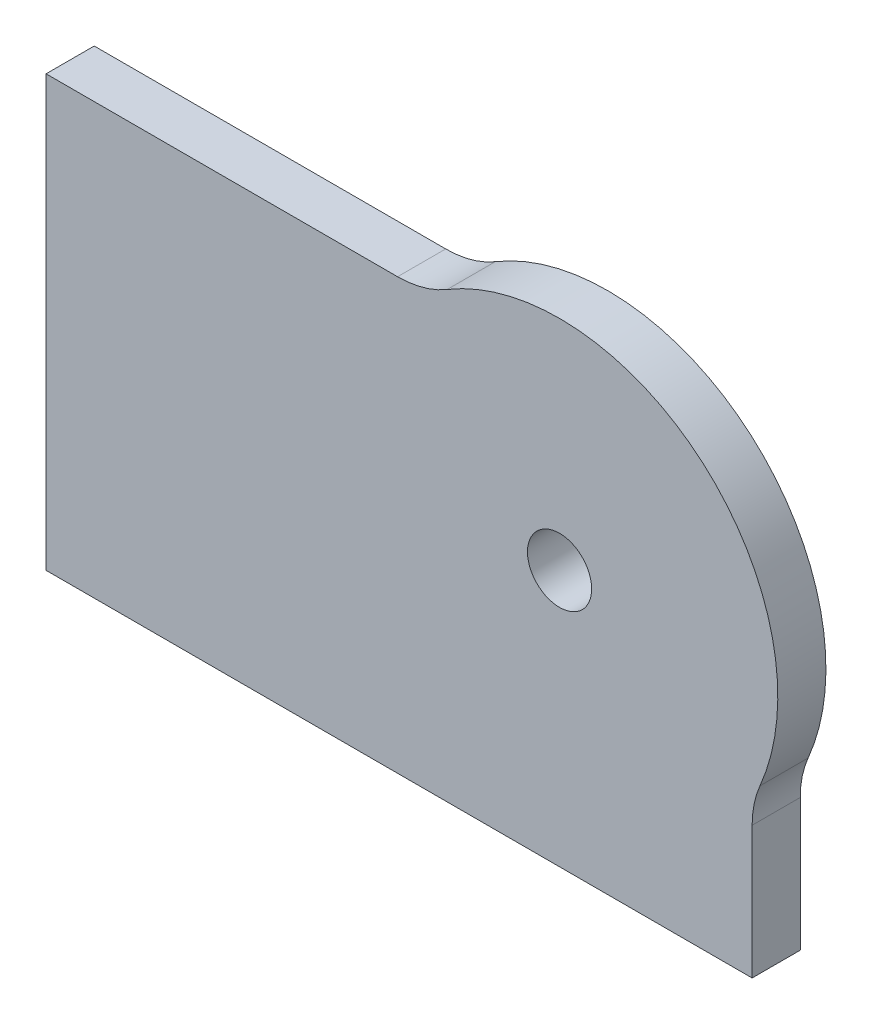
ISO-10303-21;
HEADER;
FILE_DESCRIPTION(('STEP AP214'),'2;1');
FILE_NAME('part.step','',(''),(''),'','','');
FILE_SCHEMA(('AUTOMOTIVE_DESIGN { 1 0 10303 214 1 1 1 1 }'));
ENDSEC;
DATA;
#1=APPLICATION_CONTEXT('core data for automotive mechanical design processes');
#2=APPLICATION_PROTOCOL_DEFINITION('international standard','automotive_design',2000,#1);
#3=PRODUCT_CONTEXT('',#1,'mechanical');
#4=PRODUCT('Part','Part','',(#3));
#5=PRODUCT_RELATED_PRODUCT_CATEGORY('part','',(#4));
#6=PRODUCT_DEFINITION_FORMATION('','',#4);
#7=PRODUCT_DEFINITION_CONTEXT('part definition',#1,'design');
#8=PRODUCT_DEFINITION('design','',#6,#7);
#9=PRODUCT_DEFINITION_SHAPE('','',#8);
#10=(LENGTH_UNIT() NAMED_UNIT(*) SI_UNIT(.MILLI.,.METRE.));
#11=(NAMED_UNIT(*) PLANE_ANGLE_UNIT() SI_UNIT($,.RADIAN.));
#12=(NAMED_UNIT(*) SI_UNIT($,.STERADIAN.) SOLID_ANGLE_UNIT());
#13=UNCERTAINTY_MEASURE_WITH_UNIT(LENGTH_MEASURE(1.E-05),#10,'distance_accuracy_value','');
#14=(GEOMETRIC_REPRESENTATION_CONTEXT(3) GLOBAL_UNCERTAINTY_ASSIGNED_CONTEXT((#13)) GLOBAL_UNIT_ASSIGNED_CONTEXT((#10,
#11,#12)) REPRESENTATION_CONTEXT('',''));
#15=CARTESIAN_POINT('',(0.,0.,0.));
#16=DIRECTION('',(0.,0.,1.));
#17=DIRECTION('',(1.,0.,0.));
#18=AXIS2_PLACEMENT_3D('',#15,#16,#17);
#19=CARTESIAN_POINT('',(69.5466491611252,104.14,9.525));
#20=DIRECTION('',(0.,0.,1.));
#21=DIRECTION('',(1.,0.,0.));
#22=AXIS2_PLACEMENT_3D('',#19,#20,#21);
#23=PLANE('',#22);
#24=DIRECTION('',(0.,-1.,0.));
#25=VECTOR('',#24,1.);
#26=CARTESIAN_POINT('',(0.,0.,9.525));
#27=LINE('',#26,#25);
#28=CARTESIAN_POINT('',(0.,85.09,9.525));
#29=VERTEX_POINT('',#28);
#30=CARTESIAN_POINT('',(0.,0.,9.525));
#31=VERTEX_POINT('',#30);
#32=EDGE_CURVE('E135',#29,#31,#27,.T.);
#33=ORIENTED_EDGE('',*,*,#32,.T.);
#34=DIRECTION('',(1.,0.,0.));
#35=VECTOR('',#34,1.);
#36=CARTESIAN_POINT('',(0.,0.,9.525));
#37=LINE('',#36,#35);
#38=CARTESIAN_POINT('',(139.7,0.,9.525));
#39=VERTEX_POINT('',#38);
#40=EDGE_CURVE('E88',#31,#39,#37,.T.);
#41=ORIENTED_EDGE('',*,*,#40,.T.);
#42=DIRECTION('',(0.,1.,0.));
#43=VECTOR('',#42,1.);
#44=CARTESIAN_POINT('',(139.7,0.,9.525));
#45=LINE('',#44,#43);
#46=CARTESIAN_POINT('',(139.7,26.1737863243251,9.525));
#47=VERTEX_POINT('',#46);
#48=EDGE_CURVE('E147',#39,#47,#45,.T.);
#49=ORIENTED_EDGE('',*,*,#48,.T.);
#50=CARTESIAN_POINT('',(158.75,26.1737863243251,9.525));
#51=DIRECTION('',(0.,0.,-1.));
#52=DIRECTION('',(-1.,0.,0.));
#53=AXIS2_PLACEMENT_3D('',#50,#51,#52);
#54=CIRCLE('',#53,19.05);
#55=CARTESIAN_POINT('',(141.255102040816,33.7124231638174,9.525));
#56=VERTEX_POINT('',#55);
#57=EDGE_CURVE('E104',#47,#56,#54,.T.);
#58=ORIENTED_EDGE('',*,*,#57,.T.);
#59=CARTESIAN_POINT('',(101.6,50.8,9.525));
#60=DIRECTION('',(0.,0.,1.));
#61=DIRECTION('',(1.,0.,0.));
#62=AXIS2_PLACEMENT_3D('',#59,#60,#61);
#63=CIRCLE('',#62,43.18);
#64=CARTESIAN_POINT('',(79.3588994179236,87.8114285714286,9.525));
#65=VERTEX_POINT('',#64);
#66=EDGE_CURVE('E98',#56,#65,#63,.T.);
#67=ORIENTED_EDGE('',*,*,#66,.T.);
#68=CARTESIAN_POINT('',(69.5466491611252,104.14,9.525));
#69=DIRECTION('',(0.,0.,-1.));
#70=DIRECTION('',(1.,0.,0.));
#71=AXIS2_PLACEMENT_3D('',#68,#69,#70);
#72=CIRCLE('',#71,19.05);
#73=CARTESIAN_POINT('',(69.5466491611252,85.09,9.525));
#74=VERTEX_POINT('',#73);
#75=EDGE_CURVE('E102',#65,#74,#72,.T.);
#76=ORIENTED_EDGE('',*,*,#75,.T.);
#77=DIRECTION('',(-1.,0.,0.));
#78=VECTOR('',#77,1.);
#79=CARTESIAN_POINT('',(0.,85.09,9.525));
#80=LINE('',#79,#78);
#81=EDGE_CURVE('E48',#74,#29,#80,.T.);
#82=ORIENTED_EDGE('',*,*,#81,.T.);
#83=EDGE_LOOP('',(#33,#41,#49,#58,#67,#76,#82));
#84=FACE_BOUND('',#83,.T.);
#85=CARTESIAN_POINT('',(101.6,50.8,9.525));
#86=DIRECTION('',(0.,0.,1.));
#87=DIRECTION('',(1.,0.,0.));
#88=AXIS2_PLACEMENT_3D('',#85,#86,#87);
#89=CIRCLE('',#88,6.35);
#90=CARTESIAN_POINT('',(95.25,50.8,9.525));
#91=VERTEX_POINT('',#90);
#92=EDGE_CURVE('E126',#91,#91,#89,.T.);
#93=ORIENTED_EDGE('',*,*,#92,.F.);
#94=EDGE_LOOP('',(#93));
#95=FACE_BOUND('',#94,.T.);
#96=ADVANCED_FACE('F31',(#84,#95),#23,.T.);
#97=CARTESIAN_POINT('',(69.5466491611252,104.14,0.));
#98=DIRECTION('',(0.,0.,1.));
#99=DIRECTION('',(1.,0.,0.));
#100=AXIS2_PLACEMENT_3D('',#97,#98,#99);
#101=PLANE('',#100);
#102=DIRECTION('',(0.,-1.,0.));
#103=VECTOR('',#102,1.);
#104=CARTESIAN_POINT('',(0.,0.,0.));
#105=LINE('',#104,#103);
#106=CARTESIAN_POINT('',(0.,85.09,0.));
#107=VERTEX_POINT('',#106);
#108=CARTESIAN_POINT('',(0.,0.,0.));
#109=VERTEX_POINT('',#108);
#110=EDGE_CURVE('E122',#107,#109,#105,.T.);
#111=ORIENTED_EDGE('',*,*,#110,.F.);
#112=DIRECTION('',(-1.,0.,0.));
#113=VECTOR('',#112,1.);
#114=CARTESIAN_POINT('',(0.,85.09,0.));
#115=LINE('',#114,#113);
#116=CARTESIAN_POINT('',(69.5466491611252,85.09,0.));
#117=VERTEX_POINT('',#116);
#118=EDGE_CURVE('E80',#117,#107,#115,.T.);
#119=ORIENTED_EDGE('',*,*,#118,.F.);
#120=CARTESIAN_POINT('',(69.5466491611252,104.14,0.));
#121=DIRECTION('',(0.,0.,-1.));
#122=DIRECTION('',(1.,0.,0.));
#123=AXIS2_PLACEMENT_3D('',#120,#121,#122);
#124=CIRCLE('',#123,19.05);
#125=CARTESIAN_POINT('',(79.3588994179236,87.8114285714286,0.));
#126=VERTEX_POINT('',#125);
#127=EDGE_CURVE('E74',#126,#117,#124,.T.);
#128=ORIENTED_EDGE('',*,*,#127,.F.);
#129=CARTESIAN_POINT('',(101.6,50.8,0.));
#130=DIRECTION('',(0.,0.,1.));
#131=DIRECTION('',(1.,0.,0.));
#132=AXIS2_PLACEMENT_3D('',#129,#130,#131);
#133=CIRCLE('',#132,43.18);
#134=CARTESIAN_POINT('',(141.255102040816,33.7124231638174,0.));
#135=VERTEX_POINT('',#134);
#136=EDGE_CURVE('E112',#135,#126,#133,.T.);
#137=ORIENTED_EDGE('',*,*,#136,.F.);
#138=CARTESIAN_POINT('',(158.75,26.1737863243251,0.));
#139=DIRECTION('',(0.,0.,-1.));
#140=DIRECTION('',(-1.,0.,0.));
#141=AXIS2_PLACEMENT_3D('',#138,#139,#140);
#142=CIRCLE('',#141,19.05);
#143=CARTESIAN_POINT('',(139.7,26.1737863243251,0.));
#144=VERTEX_POINT('',#143);
#145=EDGE_CURVE('E130',#144,#135,#142,.T.);
#146=ORIENTED_EDGE('',*,*,#145,.F.);
#147=DIRECTION('',(0.,1.,0.));
#148=VECTOR('',#147,1.);
#149=CARTESIAN_POINT('',(139.7,0.,0.));
#150=LINE('',#149,#148);
#151=CARTESIAN_POINT('',(139.7,0.,0.));
#152=VERTEX_POINT('',#151);
#153=EDGE_CURVE('E128',#152,#144,#150,.T.);
#154=ORIENTED_EDGE('',*,*,#153,.F.);
#155=DIRECTION('',(1.,0.,0.));
#156=VECTOR('',#155,1.);
#157=CARTESIAN_POINT('',(0.,0.,0.));
#158=LINE('',#157,#156);
#159=EDGE_CURVE('E125',#109,#152,#158,.T.);
#160=ORIENTED_EDGE('',*,*,#159,.F.);
#161=EDGE_LOOP('',(#111,#119,#128,#137,#146,#154,#160));
#162=FACE_BOUND('',#161,.T.);
#163=CARTESIAN_POINT('',(101.6,50.8,0.));
#164=DIRECTION('',(0.,0.,1.));
#165=DIRECTION('',(1.,0.,0.));
#166=AXIS2_PLACEMENT_3D('',#163,#164,#165);
#167=CIRCLE('',#166,6.35);
#168=CARTESIAN_POINT('',(95.25,50.8,0.));
#169=VERTEX_POINT('',#168);
#170=EDGE_CURVE('E159',#169,#169,#167,.T.);
#171=ORIENTED_EDGE('',*,*,#170,.T.);
#172=EDGE_LOOP('',(#171));
#173=FACE_BOUND('',#172,.T.);
#174=ADVANCED_FACE('F151',(#162,#173),#101,.F.);
#175=CARTESIAN_POINT('',(0.,0.,9.525));
#176=DIRECTION('',(1.,0.,0.));
#177=DIRECTION('',(0.,0.,-1.));
#178=AXIS2_PLACEMENT_3D('',#175,#176,#177);
#179=PLANE('',#178);
#180=ORIENTED_EDGE('',*,*,#110,.T.);
#181=DIRECTION('',(0.,0.,-1.));
#182=VECTOR('',#181,1.);
#183=CARTESIAN_POINT('',(0.,0.,9.525));
#184=LINE('',#183,#182);
#185=EDGE_CURVE('E11',#31,#109,#184,.T.);
#186=ORIENTED_EDGE('',*,*,#185,.F.);
#187=ORIENTED_EDGE('',*,*,#32,.F.);
#188=DIRECTION('',(0.,0.,-1.));
#189=VECTOR('',#188,1.);
#190=CARTESIAN_POINT('',(0.,85.09,9.525));
#191=LINE('',#190,#189);
#192=EDGE_CURVE('E118',#29,#107,#191,.T.);
#193=ORIENTED_EDGE('',*,*,#192,.T.);
#194=EDGE_LOOP('',(#180,#186,#187,#193));
#195=FACE_BOUND('',#194,.T.);
#196=ADVANCED_FACE('F33',(#195),#179,.F.);
#197=CARTESIAN_POINT('',(0.,0.,9.525));
#198=DIRECTION('',(0.,1.,0.));
#199=DIRECTION('',(0.,0.,1.));
#200=AXIS2_PLACEMENT_3D('',#197,#198,#199);
#201=PLANE('',#200);
#202=ORIENTED_EDGE('',*,*,#159,.T.);
#203=DIRECTION('',(0.,0.,-1.));
#204=VECTOR('',#203,1.);
#205=CARTESIAN_POINT('',(139.7,0.,9.525));
#206=LINE('',#205,#204);
#207=EDGE_CURVE('E40',#39,#152,#206,.T.);
#208=ORIENTED_EDGE('',*,*,#207,.F.);
#209=ORIENTED_EDGE('',*,*,#40,.F.);
#210=ORIENTED_EDGE('',*,*,#185,.T.);
#211=EDGE_LOOP('',(#202,#208,#209,#210));
#212=FACE_BOUND('',#211,.T.);
#213=ADVANCED_FACE('F185',(#212),#201,.F.);
#214=CARTESIAN_POINT('',(139.7,0.,9.525));
#215=DIRECTION('',(-1.,0.,0.));
#216=DIRECTION('',(0.,0.,1.));
#217=AXIS2_PLACEMENT_3D('',#214,#215,#216);
#218=PLANE('',#217);
#219=ORIENTED_EDGE('',*,*,#153,.T.);
#220=DIRECTION('',(0.,0.,-1.));
#221=VECTOR('',#220,1.);
#222=CARTESIAN_POINT('',(139.7,26.1737863243251,9.525));
#223=LINE('',#222,#221);
#224=EDGE_CURVE('E139',#47,#144,#223,.T.);
#225=ORIENTED_EDGE('',*,*,#224,.F.);
#226=ORIENTED_EDGE('',*,*,#48,.F.);
#227=ORIENTED_EDGE('',*,*,#207,.T.);
#228=EDGE_LOOP('',(#219,#225,#226,#227));
#229=FACE_BOUND('',#228,.T.);
#230=ADVANCED_FACE('F145',(#229),#218,.F.);
#231=CARTESIAN_POINT('',(158.75,26.1737863243251,9.525));
#232=DIRECTION('',(0.,0.,-1.));
#233=DIRECTION('',(-1.,0.,0.));
#234=AXIS2_PLACEMENT_3D('',#231,#232,#233);
#235=CYLINDRICAL_SURFACE('',#234,19.05);
#236=ORIENTED_EDGE('',*,*,#145,.T.);
#237=DIRECTION('',(0.,0.,-1.));
#238=VECTOR('',#237,1.);
#239=CARTESIAN_POINT('',(141.255102040816,33.7124231638174,9.525));
#240=LINE('',#239,#238);
#241=EDGE_CURVE('E113',#56,#135,#240,.T.);
#242=ORIENTED_EDGE('',*,*,#241,.F.);
#243=ORIENTED_EDGE('',*,*,#57,.F.);
#244=ORIENTED_EDGE('',*,*,#224,.T.);
#245=EDGE_LOOP('',(#236,#242,#243,#244));
#246=FACE_BOUND('',#245,.T.);
#247=ADVANCED_FACE('F154',(#246),#235,.F.);
#248=CARTESIAN_POINT('',(101.6,50.8,9.525));
#249=DIRECTION('',(0.,0.,-1.));
#250=DIRECTION('',(-1.,0.,0.));
#251=AXIS2_PLACEMENT_3D('',#248,#249,#250);
#252=CYLINDRICAL_SURFACE('',#251,43.18);
#253=ORIENTED_EDGE('',*,*,#136,.T.);
#254=DIRECTION('',(0.,0.,-1.));
#255=VECTOR('',#254,1.);
#256=CARTESIAN_POINT('',(79.3588994179236,87.8114285714286,9.525));
#257=LINE('',#256,#255);
#258=EDGE_CURVE('E109',#65,#126,#257,.T.);
#259=ORIENTED_EDGE('',*,*,#258,.F.);
#260=ORIENTED_EDGE('',*,*,#66,.F.);
#261=ORIENTED_EDGE('',*,*,#241,.T.);
#262=EDGE_LOOP('',(#253,#259,#260,#261));
#263=FACE_BOUND('',#262,.T.);
#264=ADVANCED_FACE('F110',(#263),#252,.T.);
#265=CARTESIAN_POINT('',(69.5466491611252,104.14,9.525));
#266=DIRECTION('',(0.,0.,-1.));
#267=DIRECTION('',(-1.,0.,0.));
#268=AXIS2_PLACEMENT_3D('',#265,#266,#267);
#269=CYLINDRICAL_SURFACE('',#268,19.05);
#270=ORIENTED_EDGE('',*,*,#127,.T.);
#271=DIRECTION('',(0.,0.,-1.));
#272=VECTOR('',#271,1.);
#273=CARTESIAN_POINT('',(69.5466491611252,85.09,9.525));
#274=LINE('',#273,#272);
#275=EDGE_CURVE('E114',#74,#117,#274,.T.);
#276=ORIENTED_EDGE('',*,*,#275,.F.);
#277=ORIENTED_EDGE('',*,*,#75,.F.);
#278=ORIENTED_EDGE('',*,*,#258,.T.);
#279=EDGE_LOOP('',(#270,#276,#277,#278));
#280=FACE_BOUND('',#279,.T.);
#281=ADVANCED_FACE('F116',(#280),#269,.F.);
#282=CARTESIAN_POINT('',(0.,85.09,9.525));
#283=DIRECTION('',(0.,-1.,0.));
#284=DIRECTION('',(0.,0.,-1.));
#285=AXIS2_PLACEMENT_3D('',#282,#283,#284);
#286=PLANE('',#285);
#287=ORIENTED_EDGE('',*,*,#118,.T.);
#288=ORIENTED_EDGE('',*,*,#192,.F.);
#289=ORIENTED_EDGE('',*,*,#81,.F.);
#290=ORIENTED_EDGE('',*,*,#275,.T.);
#291=EDGE_LOOP('',(#287,#288,#289,#290));
#292=FACE_BOUND('',#291,.T.);
#293=ADVANCED_FACE('F175',(#292),#286,.F.);
#294=CARTESIAN_POINT('',(101.6,50.8,9.525));
#295=DIRECTION('',(0.,0.,-1.));
#296=DIRECTION('',(-1.,0.,0.));
#297=AXIS2_PLACEMENT_3D('',#294,#295,#296);
#298=CYLINDRICAL_SURFACE('',#297,6.35);
#299=CARTESIAN_POINT('',(95.25,50.8,9.525));
#300=CARTESIAN_POINT('',(95.25,50.8,9.42578125));
#301=CARTESIAN_POINT('',(95.25,50.8,9.3265625));
#302=CARTESIAN_POINT('',(95.25,50.8,9.128125));
#303=CARTESIAN_POINT('',(95.25,50.8,9.02890625));
#304=CARTESIAN_POINT('',(95.25,50.8,8.83046875));
#305=CARTESIAN_POINT('',(95.25,50.8,8.73125));
#306=CARTESIAN_POINT('',(95.25,50.8,8.5328125));
#307=CARTESIAN_POINT('',(95.25,50.8,8.43359375));
#308=CARTESIAN_POINT('',(95.25,50.8,8.23515625));
#309=CARTESIAN_POINT('',(95.25,50.8,8.1359375));
#310=CARTESIAN_POINT('',(95.25,50.8,7.9375));
#311=CARTESIAN_POINT('',(95.25,50.8,7.83828125));
#312=CARTESIAN_POINT('',(95.25,50.8,7.63984375));
#313=CARTESIAN_POINT('',(95.25,50.8,7.540625));
#314=CARTESIAN_POINT('',(95.25,50.8,7.3421875));
#315=CARTESIAN_POINT('',(95.25,50.8,7.24296875));
#316=CARTESIAN_POINT('',(95.25,50.8,7.04453125));
#317=CARTESIAN_POINT('',(95.25,50.8,6.9453125));
#318=CARTESIAN_POINT('',(95.25,50.8,6.746875));
#319=CARTESIAN_POINT('',(95.25,50.8,6.64765625));
#320=CARTESIAN_POINT('',(95.25,50.8,6.44921875));
#321=CARTESIAN_POINT('',(95.25,50.8,6.35));
#322=CARTESIAN_POINT('',(95.25,50.8,6.1515625));
#323=CARTESIAN_POINT('',(95.25,50.8,6.05234375));
#324=CARTESIAN_POINT('',(95.25,50.8,5.85390625));
#325=CARTESIAN_POINT('',(95.25,50.8,5.7546875));
#326=CARTESIAN_POINT('',(95.25,50.8,5.55625));
#327=CARTESIAN_POINT('',(95.25,50.8,5.45703125));
#328=CARTESIAN_POINT('',(95.25,50.8,5.25859375));
#329=CARTESIAN_POINT('',(95.25,50.8,5.159375));
#330=CARTESIAN_POINT('',(95.25,50.8,4.9609375));
#331=CARTESIAN_POINT('',(95.25,50.8,4.86171875));
#332=CARTESIAN_POINT('',(95.25,50.8,4.66328125));
#333=CARTESIAN_POINT('',(95.25,50.8,4.5640625));
#334=CARTESIAN_POINT('',(95.25,50.8,4.365625));
#335=CARTESIAN_POINT('',(95.25,50.8,4.26640625));
#336=CARTESIAN_POINT('',(95.25,50.8,4.06796875));
#337=CARTESIAN_POINT('',(95.25,50.8,3.96875));
#338=CARTESIAN_POINT('',(95.25,50.8,3.7703125));
#339=CARTESIAN_POINT('',(95.25,50.8,3.67109375));
#340=CARTESIAN_POINT('',(95.25,50.8,3.47265625));
#341=CARTESIAN_POINT('',(95.25,50.8,3.3734375));
#342=CARTESIAN_POINT('',(95.25,50.8,3.175));
#343=CARTESIAN_POINT('',(95.25,50.8,3.07578125));
#344=CARTESIAN_POINT('',(95.25,50.8,2.87734375));
#345=CARTESIAN_POINT('',(95.25,50.8,2.778125));
#346=CARTESIAN_POINT('',(95.25,50.8,2.5796875));
#347=CARTESIAN_POINT('',(95.25,50.8,2.48046875));
#348=CARTESIAN_POINT('',(95.25,50.8,2.28203125));
#349=CARTESIAN_POINT('',(95.25,50.8,2.1828125));
#350=CARTESIAN_POINT('',(95.25,50.8,1.984375));
#351=CARTESIAN_POINT('',(95.25,50.8,1.88515625));
#352=CARTESIAN_POINT('',(95.25,50.8,1.68671875));
#353=CARTESIAN_POINT('',(95.25,50.8,1.5875));
#354=CARTESIAN_POINT('',(95.25,50.8,1.3890625));
#355=CARTESIAN_POINT('',(95.25,50.8,1.28984375));
#356=CARTESIAN_POINT('',(95.25,50.8,1.09140625));
#357=CARTESIAN_POINT('',(95.25,50.8,0.992187500000001));
#358=CARTESIAN_POINT('',(95.25,50.8,0.793750000000001));
#359=CARTESIAN_POINT('',(95.25,50.8,0.69453125));
#360=CARTESIAN_POINT('',(95.25,50.8,0.49609375));
#361=CARTESIAN_POINT('',(95.25,50.8,0.396875));
#362=CARTESIAN_POINT('',(95.25,50.8,0.1984375));
#363=CARTESIAN_POINT('',(95.25,50.8,0.0992187500000001));
#364=CARTESIAN_POINT('',(95.25,50.8,0.));
#365=B_SPLINE_CURVE_WITH_KNOTS('',3,(#299,#300,#301,#302,#303,#304,#305,#306,#307,#308,#309,
#310,#311,#312,#313,#314,#315,#316,#317,#318,#319,#320,#321,#322,#323,#324,#325,#326,#327,#328,
#329,#330,#331,#332,#333,#334,#335,#336,#337,#338,#339,#340,#341,#342,#343,#344,#345,#346,#347,
#348,#349,#350,#351,#352,#353,#354,#355,#356,#357,#358,#359,#360,#361,#362,#363,#364),
.UNSPECIFIED.,.F.,.F.,(4,2,2,2,2,2,2,2,2,2,2,2,2,2,2,2,2,2,2,2,2,2,2,2,2,2,2,2,2,2,2,2,4),(0.,
0.297656249999998,0.595312499999999,0.892968749999999,1.190625,1.48828125,1.7859375,2.08359375,
2.38125,2.67890625,2.9765625,3.27421875,3.571875,3.86953125,4.1671875,4.46484375,4.7625,
5.06015625,5.3578125,5.65546875,5.953125,6.25078125,6.5484375,6.84609375,7.14375,7.44140625,
7.7390625,8.03671875,8.334375,8.63203125,8.9296875,9.22734375,9.525),.UNSPECIFIED.);
#366=EDGE_CURVE('BSEAM165',#91,#169,#365,.T.);
#367=ORIENTED_EDGE('',*,*,#92,.T.);
#368=ORIENTED_EDGE('',*,*,#170,.F.);
#369=ORIENTED_EDGE('',*,*,#366,.T.);
#370=ORIENTED_EDGE('',*,*,#366,.F.);
#371=EDGE_LOOP('',(#367,#369,#368,#370));
#372=FACE_BOUND('',#371,.T.);
#373=ADVANCED_FACE('F165',(#372),#298,.F.);
#374=CLOSED_SHELL('',(#96,#174,#196,#213,#230,#247,#264,#281,#293,#373));
#375=MANIFOLD_SOLID_BREP('B2',#374);
#376=ADVANCED_BREP_SHAPE_REPRESENTATION('',(#18,#375),#14);
#377=SHAPE_DEFINITION_REPRESENTATION(#9,#376);
ENDSEC;
END-ISO-10303-21;
